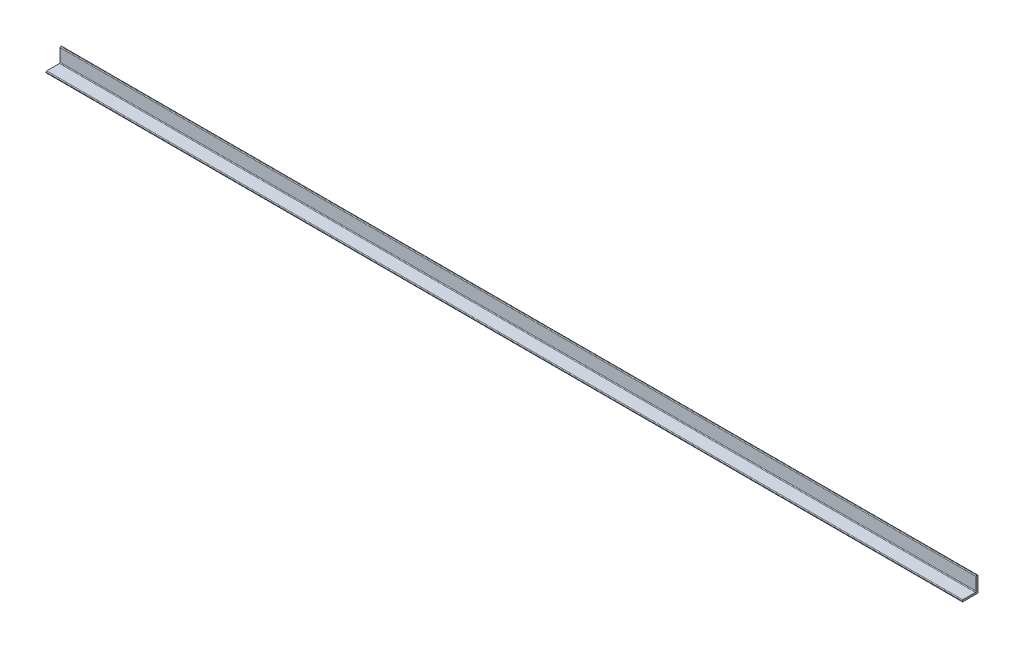
ISO-10303-21;
HEADER;
FILE_DESCRIPTION(('STEP AP214'),'2;1');
FILE_NAME('part.step','',(''),(''),'','','');
FILE_SCHEMA(('AUTOMOTIVE_DESIGN { 1 0 10303 214 1 1 1 1 }'));
ENDSEC;
DATA;
#1=APPLICATION_CONTEXT('core data for automotive mechanical design processes');
#2=APPLICATION_PROTOCOL_DEFINITION('international standard','automotive_design',2000,#1);
#3=PRODUCT_CONTEXT('',#1,'mechanical');
#4=PRODUCT('Part','Part','',(#3));
#5=PRODUCT_RELATED_PRODUCT_CATEGORY('part','',(#4));
#6=PRODUCT_DEFINITION_FORMATION('','',#4);
#7=PRODUCT_DEFINITION_CONTEXT('part definition',#1,'design');
#8=PRODUCT_DEFINITION('design','',#6,#7);
#9=PRODUCT_DEFINITION_SHAPE('','',#8);
#10=(LENGTH_UNIT() NAMED_UNIT(*) SI_UNIT(.MILLI.,.METRE.));
#11=(NAMED_UNIT(*) PLANE_ANGLE_UNIT() SI_UNIT($,.RADIAN.));
#12=(NAMED_UNIT(*) SI_UNIT($,.STERADIAN.) SOLID_ANGLE_UNIT());
#13=UNCERTAINTY_MEASURE_WITH_UNIT(LENGTH_MEASURE(1.E-05),#10,'distance_accuracy_value','');
#14=(GEOMETRIC_REPRESENTATION_CONTEXT(3) GLOBAL_UNCERTAINTY_ASSIGNED_CONTEXT((#13)) GLOBAL_UNIT_ASSIGNED_CONTEXT((#10,
#11,#12)) REPRESENTATION_CONTEXT('',''));
#15=CARTESIAN_POINT('',(0.,0.,0.));
#16=DIRECTION('',(0.,0.,1.));
#17=DIRECTION('',(1.,0.,0.));
#18=AXIS2_PLACEMENT_3D('',#15,#16,#17);
#19=CARTESIAN_POINT('',(650.,2.5,-11.25));
#20=DIRECTION('',(-1.,0.,0.));
#21=DIRECTION('',(0.,0.,1.));
#22=AXIS2_PLACEMENT_3D('',#19,#20,#21);
#23=PLANE('',#22);
#24=DIRECTION('',(0.,0.,-1.));
#25=VECTOR('',#24,1.);
#26=CARTESIAN_POINT('',(650.,0.,-11.25));
#27=LINE('',#26,#25);
#28=CARTESIAN_POINT('',(650.,0.,10.25));
#29=VERTEX_POINT('',#28);
#30=CARTESIAN_POINT('',(650.,0.,-10.25));
#31=VERTEX_POINT('',#30);
#32=EDGE_CURVE('E213',#29,#31,#27,.T.);
#33=ORIENTED_EDGE('',*,*,#32,.T.);
#34=CARTESIAN_POINT('',(650.,1.,-10.25));
#35=DIRECTION('',(-1.,0.,0.));
#36=DIRECTION('',(0.,0.,1.));
#37=AXIS2_PLACEMENT_3D('',#34,#35,#36);
#38=CIRCLE('',#37,1.);
#39=CARTESIAN_POINT('',(650.,1.,-11.25));
#40=VERTEX_POINT('',#39);
#41=EDGE_CURVE('E167',#31,#40,#38,.F.);
#42=ORIENTED_EDGE('',*,*,#41,.T.);
#43=DIRECTION('',(0.,-1.,0.));
#44=VECTOR('',#43,1.);
#45=CARTESIAN_POINT('',(650.,2.5,-11.25));
#46=LINE('',#45,#44);
#47=CARTESIAN_POINT('',(650.,21.5,-11.25));
#48=VERTEX_POINT('',#47);
#49=EDGE_CURVE('E142',#48,#40,#46,.T.);
#50=ORIENTED_EDGE('',*,*,#49,.F.);
#51=CARTESIAN_POINT('',(650.,21.5,-10.25));
#52=DIRECTION('',(-1.,0.,0.));
#53=DIRECTION('',(0.,0.,1.));
#54=AXIS2_PLACEMENT_3D('',#51,#52,#53);
#55=CIRCLE('',#54,1.);
#56=CARTESIAN_POINT('',(650.,22.5,-10.25));
#57=VERTEX_POINT('',#56);
#58=EDGE_CURVE('E146',#48,#57,#55,.F.);
#59=ORIENTED_EDGE('',*,*,#58,.T.);
#60=DIRECTION('',(0.,0.,-1.));
#61=VECTOR('',#60,1.);
#62=CARTESIAN_POINT('',(650.,22.5,-11.25));
#63=LINE('',#62,#61);
#64=CARTESIAN_POINT('',(650.,22.5,-9.74999999999999));
#65=VERTEX_POINT('',#64);
#66=EDGE_CURVE('E216',#65,#57,#63,.T.);
#67=ORIENTED_EDGE('',*,*,#66,.F.);
#68=CARTESIAN_POINT('',(650.,21.5,-9.74999999999999));
#69=DIRECTION('',(-1.,0.,0.));
#70=DIRECTION('',(0.,0.,1.));
#71=AXIS2_PLACEMENT_3D('',#68,#69,#70);
#72=CIRCLE('',#71,1.);
#73=CARTESIAN_POINT('',(650.,21.5,-8.75));
#74=VERTEX_POINT('',#73);
#75=EDGE_CURVE('E163',#65,#74,#72,.F.);
#76=ORIENTED_EDGE('',*,*,#75,.T.);
#77=DIRECTION('',(0.,-1.,0.));
#78=VECTOR('',#77,1.);
#79=CARTESIAN_POINT('',(650.,22.5,-8.75));
#80=LINE('',#79,#78);
#81=CARTESIAN_POINT('',(650.,3.5,-8.75));
#82=VERTEX_POINT('',#81);
#83=EDGE_CURVE('E192',#74,#82,#80,.T.);
#84=ORIENTED_EDGE('',*,*,#83,.T.);
#85=CARTESIAN_POINT('',(650.,3.5,-7.75));
#86=DIRECTION('',(-1.,0.,0.));
#87=DIRECTION('',(0.,0.,1.));
#88=AXIS2_PLACEMENT_3D('',#85,#86,#87);
#89=CIRCLE('',#88,1.);
#90=CARTESIAN_POINT('',(650.,2.5,-7.75));
#91=VERTEX_POINT('',#90);
#92=EDGE_CURVE('E40',#82,#91,#89,.T.);
#93=ORIENTED_EDGE('',*,*,#92,.T.);
#94=DIRECTION('',(0.,0.,-1.));
#95=VECTOR('',#94,1.);
#96=CARTESIAN_POINT('',(650.,2.5,-11.25));
#97=LINE('',#96,#95);
#98=CARTESIAN_POINT('',(650.,2.5,10.25));
#99=VERTEX_POINT('',#98);
#100=EDGE_CURVE('E190',#99,#91,#97,.T.);
#101=ORIENTED_EDGE('',*,*,#100,.F.);
#102=CARTESIAN_POINT('',(650.,1.5,10.25));
#103=DIRECTION('',(-1.,0.,0.));
#104=DIRECTION('',(0.,0.,1.));
#105=AXIS2_PLACEMENT_3D('',#102,#103,#104);
#106=CIRCLE('',#105,1.);
#107=CARTESIAN_POINT('',(650.,1.5,11.25));
#108=VERTEX_POINT('',#107);
#109=EDGE_CURVE('E55',#99,#108,#106,.F.);
#110=ORIENTED_EDGE('',*,*,#109,.T.);
#111=DIRECTION('',(0.,-1.,0.));
#112=VECTOR('',#111,1.);
#113=CARTESIAN_POINT('',(650.,2.5,11.25));
#114=LINE('',#113,#112);
#115=CARTESIAN_POINT('',(650.,1.,11.25));
#116=VERTEX_POINT('',#115);
#117=EDGE_CURVE('E220',#108,#116,#114,.T.);
#118=ORIENTED_EDGE('',*,*,#117,.T.);
#119=CARTESIAN_POINT('',(650.,1.,10.25));
#120=DIRECTION('',(-1.,0.,0.));
#121=DIRECTION('',(0.,0.,1.));
#122=AXIS2_PLACEMENT_3D('',#119,#120,#121);
#123=CIRCLE('',#122,1.);
#124=EDGE_CURVE('E47',#116,#29,#123,.F.);
#125=ORIENTED_EDGE('',*,*,#124,.T.);
#126=EDGE_LOOP('',(#33,#42,#50,#59,#67,#76,#84,#93,#101,#110,#118,#125));
#127=FACE_BOUND('',#126,.T.);
#128=ADVANCED_FACE('F32',(#127),#23,.F.);
#129=CARTESIAN_POINT('',(-650.,2.5,-11.25));
#130=DIRECTION('',(0.,0.,1.));
#131=DIRECTION('',(1.,0.,0.));
#132=AXIS2_PLACEMENT_3D('',#129,#130,#131);
#133=PLANE('',#132);
#134=ORIENTED_EDGE('',*,*,#49,.T.);
#135=DIRECTION('',(-1.,0.,0.));
#136=VECTOR('',#135,1.);
#137=CARTESIAN_POINT('',(-650.,1.,-11.25));
#138=LINE('',#137,#136);
#139=CARTESIAN_POINT('',(-650.,1.,-11.25));
#140=VERTEX_POINT('',#139);
#141=EDGE_CURVE('E133',#40,#140,#138,.T.);
#142=ORIENTED_EDGE('',*,*,#141,.T.);
#143=DIRECTION('',(0.,-1.,0.));
#144=VECTOR('',#143,1.);
#145=CARTESIAN_POINT('',(-650.,2.5,-11.25));
#146=LINE('',#145,#144);
#147=CARTESIAN_POINT('',(-650.,21.5,-11.25));
#148=VERTEX_POINT('',#147);
#149=EDGE_CURVE('E125',#148,#140,#146,.T.);
#150=ORIENTED_EDGE('',*,*,#149,.F.);
#151=DIRECTION('',(-1.,0.,0.));
#152=VECTOR('',#151,1.);
#153=CARTESIAN_POINT('',(650.,21.5,-11.25));
#154=LINE('',#153,#152);
#155=EDGE_CURVE('E139',#148,#48,#154,.F.);
#156=ORIENTED_EDGE('',*,*,#155,.T.);
#157=EDGE_LOOP('',(#134,#142,#150,#156));
#158=FACE_BOUND('',#157,.T.);
#159=ADVANCED_FACE('F138',(#158),#133,.F.);
#160=CARTESIAN_POINT('',(-650.,2.5,-11.25));
#161=DIRECTION('',(1.,0.,0.));
#162=DIRECTION('',(0.,0.,-1.));
#163=AXIS2_PLACEMENT_3D('',#160,#161,#162);
#164=PLANE('',#163);
#165=ORIENTED_EDGE('',*,*,#149,.T.);
#166=CARTESIAN_POINT('',(-650.,1.,-10.25));
#167=DIRECTION('',(1.,0.,0.));
#168=DIRECTION('',(0.,0.,-1.));
#169=AXIS2_PLACEMENT_3D('',#166,#167,#168);
#170=CIRCLE('',#169,1.);
#171=CARTESIAN_POINT('',(-650.,0.,-10.25));
#172=VERTEX_POINT('',#171);
#173=EDGE_CURVE('E156',#140,#172,#170,.F.);
#174=ORIENTED_EDGE('',*,*,#173,.T.);
#175=DIRECTION('',(0.,0.,1.));
#176=VECTOR('',#175,1.);
#177=CARTESIAN_POINT('',(-650.,0.,-11.25));
#178=LINE('',#177,#176);
#179=CARTESIAN_POINT('',(-650.,0.,10.25));
#180=VERTEX_POINT('',#179);
#181=EDGE_CURVE('E202',#172,#180,#178,.T.);
#182=ORIENTED_EDGE('',*,*,#181,.T.);
#183=CARTESIAN_POINT('',(-650.,1.,10.25));
#184=DIRECTION('',(1.,0.,0.));
#185=DIRECTION('',(0.,0.,-1.));
#186=AXIS2_PLACEMENT_3D('',#183,#184,#185);
#187=CIRCLE('',#186,1.);
#188=CARTESIAN_POINT('',(-650.,1.,11.25));
#189=VERTEX_POINT('',#188);
#190=EDGE_CURVE('E154',#180,#189,#187,.F.);
#191=ORIENTED_EDGE('',*,*,#190,.T.);
#192=DIRECTION('',(0.,-1.,0.));
#193=VECTOR('',#192,1.);
#194=CARTESIAN_POINT('',(-650.,2.5,11.25));
#195=LINE('',#194,#193);
#196=CARTESIAN_POINT('',(-650.,1.5,11.25));
#197=VERTEX_POINT('',#196);
#198=EDGE_CURVE('E143',#197,#189,#195,.T.);
#199=ORIENTED_EDGE('',*,*,#198,.F.);
#200=CARTESIAN_POINT('',(-650.,1.5,10.25));
#201=DIRECTION('',(1.,0.,0.));
#202=DIRECTION('',(0.,0.,-1.));
#203=AXIS2_PLACEMENT_3D('',#200,#201,#202);
#204=CIRCLE('',#203,1.);
#205=CARTESIAN_POINT('',(-650.,2.5,10.25));
#206=VERTEX_POINT('',#205);
#207=EDGE_CURVE('E152',#197,#206,#204,.F.);
#208=ORIENTED_EDGE('',*,*,#207,.T.);
#209=DIRECTION('',(0.,0.,1.));
#210=VECTOR('',#209,1.);
#211=CARTESIAN_POINT('',(-650.,2.5,-11.25));
#212=LINE('',#211,#210);
#213=CARTESIAN_POINT('',(-650.,2.5,-7.75));
#214=VERTEX_POINT('',#213);
#215=EDGE_CURVE('E201',#214,#206,#212,.T.);
#216=ORIENTED_EDGE('',*,*,#215,.F.);
#217=CARTESIAN_POINT('',(-650.,3.5,-7.75));
#218=DIRECTION('',(1.,0.,0.));
#219=DIRECTION('',(0.,0.,-1.));
#220=AXIS2_PLACEMENT_3D('',#217,#218,#219);
#221=CIRCLE('',#220,1.);
#222=CARTESIAN_POINT('',(-650.,3.5,-8.75));
#223=VERTEX_POINT('',#222);
#224=EDGE_CURVE('E11',#214,#223,#221,.T.);
#225=ORIENTED_EDGE('',*,*,#224,.T.);
#226=DIRECTION('',(0.,-1.,0.));
#227=VECTOR('',#226,1.);
#228=CARTESIAN_POINT('',(-650.,22.5,-8.75));
#229=LINE('',#228,#227);
#230=CARTESIAN_POINT('',(-650.,21.5,-8.75));
#231=VERTEX_POINT('',#230);
#232=EDGE_CURVE('E208',#231,#223,#229,.T.);
#233=ORIENTED_EDGE('',*,*,#232,.F.);
#234=CARTESIAN_POINT('',(-650.,21.5,-9.74999999999999));
#235=DIRECTION('',(1.,0.,0.));
#236=DIRECTION('',(0.,0.,-1.));
#237=AXIS2_PLACEMENT_3D('',#234,#235,#236);
#238=CIRCLE('',#237,1.);
#239=CARTESIAN_POINT('',(-650.,22.5,-9.74999999999999));
#240=VERTEX_POINT('',#239);
#241=EDGE_CURVE('E132',#231,#240,#238,.F.);
#242=ORIENTED_EDGE('',*,*,#241,.T.);
#243=DIRECTION('',(0.,0.,1.));
#244=VECTOR('',#243,1.);
#245=CARTESIAN_POINT('',(-650.,22.5,-11.25));
#246=LINE('',#245,#244);
#247=CARTESIAN_POINT('',(-650.,22.5,-10.25));
#248=VERTEX_POINT('',#247);
#249=EDGE_CURVE('E127',#248,#240,#246,.T.);
#250=ORIENTED_EDGE('',*,*,#249,.F.);
#251=CARTESIAN_POINT('',(-650.,21.5,-10.25));
#252=DIRECTION('',(1.,0.,0.));
#253=DIRECTION('',(0.,0.,-1.));
#254=AXIS2_PLACEMENT_3D('',#251,#252,#253);
#255=CIRCLE('',#254,1.);
#256=EDGE_CURVE('E122',#248,#148,#255,.F.);
#257=ORIENTED_EDGE('',*,*,#256,.T.);
#258=EDGE_LOOP('',(#165,#174,#182,#191,#199,#208,#216,#225,#233,#242,#250,#257));
#259=FACE_BOUND('',#258,.T.);
#260=ADVANCED_FACE('F124',(#259),#164,.F.);
#261=CARTESIAN_POINT('',(-650.,2.5,11.25));
#262=DIRECTION('',(0.,0.,-1.));
#263=DIRECTION('',(-1.,0.,0.));
#264=AXIS2_PLACEMENT_3D('',#261,#262,#263);
#265=PLANE('',#264);
#266=ORIENTED_EDGE('',*,*,#198,.T.);
#267=DIRECTION('',(1.,0.,0.));
#268=VECTOR('',#267,1.);
#269=CARTESIAN_POINT('',(-650.,1.,11.25));
#270=LINE('',#269,#268);
#271=EDGE_CURVE('E171',#189,#116,#270,.T.);
#272=ORIENTED_EDGE('',*,*,#271,.T.);
#273=ORIENTED_EDGE('',*,*,#117,.F.);
#274=DIRECTION('',(1.,0.,0.));
#275=VECTOR('',#274,1.);
#276=CARTESIAN_POINT('',(-650.,1.5,11.25));
#277=LINE('',#276,#275);
#278=EDGE_CURVE('E169',#108,#197,#277,.F.);
#279=ORIENTED_EDGE('',*,*,#278,.T.);
#280=EDGE_LOOP('',(#266,#272,#273,#279));
#281=FACE_BOUND('',#280,.T.);
#282=ADVANCED_FACE('F228',(#281),#265,.F.);
#283=CARTESIAN_POINT('',(0.,2.5,0.));
#284=DIRECTION('',(0.,1.,0.));
#285=DIRECTION('',(0.,0.,1.));
#286=AXIS2_PLACEMENT_3D('',#283,#284,#285);
#287=PLANE('',#286);
#288=ORIENTED_EDGE('',*,*,#215,.T.);
#289=DIRECTION('',(1.,0.,0.));
#290=VECTOR('',#289,1.);
#291=CARTESIAN_POINT('',(650.,2.5,10.25));
#292=LINE('',#291,#290);
#293=EDGE_CURVE('E175',#206,#99,#292,.T.);
#294=ORIENTED_EDGE('',*,*,#293,.T.);
#295=ORIENTED_EDGE('',*,*,#100,.T.);
#296=DIRECTION('',(1.,0.,0.));
#297=VECTOR('',#296,1.);
#298=CARTESIAN_POINT('',(0.,2.5,-7.75));
#299=LINE('',#298,#297);
#300=EDGE_CURVE('E173',#91,#214,#299,.F.);
#301=ORIENTED_EDGE('',*,*,#300,.T.);
#302=EDGE_LOOP('',(#288,#294,#295,#301));
#303=FACE_BOUND('',#302,.T.);
#304=ADVANCED_FACE('F198',(#303),#287,.T.);
#305=CARTESIAN_POINT('',(0.,0.,0.));
#306=DIRECTION('',(0.,1.,0.));
#307=DIRECTION('',(0.,0.,1.));
#308=AXIS2_PLACEMENT_3D('',#305,#306,#307);
#309=PLANE('',#308);
#310=ORIENTED_EDGE('',*,*,#181,.F.);
#311=DIRECTION('',(-1.,0.,0.));
#312=VECTOR('',#311,1.);
#313=CARTESIAN_POINT('',(0.,0.,-10.25));
#314=LINE('',#313,#312);
#315=EDGE_CURVE('E160',#172,#31,#314,.F.);
#316=ORIENTED_EDGE('',*,*,#315,.T.);
#317=ORIENTED_EDGE('',*,*,#32,.F.);
#318=DIRECTION('',(1.,0.,0.));
#319=VECTOR('',#318,1.);
#320=CARTESIAN_POINT('',(0.,0.,10.25));
#321=LINE('',#320,#319);
#322=EDGE_CURVE('E158',#29,#180,#321,.F.);
#323=ORIENTED_EDGE('',*,*,#322,.T.);
#324=EDGE_LOOP('',(#310,#316,#317,#323));
#325=FACE_BOUND('',#324,.T.);
#326=ADVANCED_FACE('F236',(#325),#309,.F.);
#327=CARTESIAN_POINT('',(-650.,22.5,-8.75));
#328=DIRECTION('',(0.,0.,-1.));
#329=DIRECTION('',(-1.,0.,0.));
#330=AXIS2_PLACEMENT_3D('',#327,#328,#329);
#331=PLANE('',#330);
#332=ORIENTED_EDGE('',*,*,#232,.T.);
#333=DIRECTION('',(1.,0.,0.));
#334=VECTOR('',#333,1.);
#335=CARTESIAN_POINT('',(-650.,3.5,-8.75));
#336=LINE('',#335,#334);
#337=EDGE_CURVE('E180',#223,#82,#336,.T.);
#338=ORIENTED_EDGE('',*,*,#337,.T.);
#339=ORIENTED_EDGE('',*,*,#83,.F.);
#340=DIRECTION('',(1.,0.,0.));
#341=VECTOR('',#340,1.);
#342=CARTESIAN_POINT('',(-650.,21.5,-8.75));
#343=LINE('',#342,#341);
#344=EDGE_CURVE('E178',#74,#231,#343,.F.);
#345=ORIENTED_EDGE('',*,*,#344,.T.);
#346=EDGE_LOOP('',(#332,#338,#339,#345));
#347=FACE_BOUND('',#346,.T.);
#348=ADVANCED_FACE('F211',(#347),#331,.F.);
#349=CARTESIAN_POINT('',(0.,22.5,0.));
#350=DIRECTION('',(0.,1.,0.));
#351=DIRECTION('',(0.,0.,1.));
#352=AXIS2_PLACEMENT_3D('',#349,#350,#351);
#353=PLANE('',#352);
#354=ORIENTED_EDGE('',*,*,#249,.T.);
#355=DIRECTION('',(1.,0.,0.));
#356=VECTOR('',#355,1.);
#357=CARTESIAN_POINT('',(650.,22.5,-9.74999999999999));
#358=LINE('',#357,#356);
#359=EDGE_CURVE('E185',#240,#65,#358,.T.);
#360=ORIENTED_EDGE('',*,*,#359,.T.);
#361=ORIENTED_EDGE('',*,*,#66,.T.);
#362=DIRECTION('',(-1.,0.,0.));
#363=VECTOR('',#362,1.);
#364=CARTESIAN_POINT('',(-650.,22.5,-10.25));
#365=LINE('',#364,#363);
#366=EDGE_CURVE('E183',#57,#248,#365,.T.);
#367=ORIENTED_EDGE('',*,*,#366,.T.);
#368=EDGE_LOOP('',(#354,#360,#361,#367));
#369=FACE_BOUND('',#368,.T.);
#370=ADVANCED_FACE('F261',(#369),#353,.T.);
#371=CARTESIAN_POINT('',(-650.,1.,-10.25));
#372=DIRECTION('',(-1.,0.,0.));
#373=DIRECTION('',(0.,0.,1.));
#374=AXIS2_PLACEMENT_3D('',#371,#372,#373);
#375=CYLINDRICAL_SURFACE('',#374,1.);
#376=ORIENTED_EDGE('',*,*,#41,.F.);
#377=ORIENTED_EDGE('',*,*,#315,.F.);
#378=ORIENTED_EDGE('',*,*,#173,.F.);
#379=ORIENTED_EDGE('',*,*,#141,.F.);
#380=EDGE_LOOP('',(#376,#377,#378,#379));
#381=FACE_BOUND('',#380,.T.);
#382=ADVANCED_FACE('F240',(#381),#375,.T.);
#383=CARTESIAN_POINT('',(-650.,1.,10.25));
#384=DIRECTION('',(1.,0.,0.));
#385=DIRECTION('',(0.,0.,-1.));
#386=AXIS2_PLACEMENT_3D('',#383,#384,#385);
#387=CYLINDRICAL_SURFACE('',#386,1.);
#388=ORIENTED_EDGE('',*,*,#190,.F.);
#389=ORIENTED_EDGE('',*,*,#322,.F.);
#390=ORIENTED_EDGE('',*,*,#124,.F.);
#391=ORIENTED_EDGE('',*,*,#271,.F.);
#392=EDGE_LOOP('',(#388,#389,#390,#391));
#393=FACE_BOUND('',#392,.T.);
#394=ADVANCED_FACE('F232',(#393),#387,.T.);
#395=CARTESIAN_POINT('',(0.,1.5,10.25));
#396=DIRECTION('',(-1.,0.,0.));
#397=DIRECTION('',(0.,0.,1.));
#398=AXIS2_PLACEMENT_3D('',#395,#396,#397);
#399=CYLINDRICAL_SURFACE('',#398,1.);
#400=ORIENTED_EDGE('',*,*,#207,.F.);
#401=ORIENTED_EDGE('',*,*,#278,.F.);
#402=ORIENTED_EDGE('',*,*,#109,.F.);
#403=ORIENTED_EDGE('',*,*,#293,.F.);
#404=EDGE_LOOP('',(#400,#401,#402,#403));
#405=FACE_BOUND('',#404,.T.);
#406=ADVANCED_FACE('F242',(#405),#399,.T.);
#407=CARTESIAN_POINT('',(-650.,3.5,-7.75));
#408=DIRECTION('',(1.,0.,0.));
#409=DIRECTION('',(0.,0.,-1.));
#410=AXIS2_PLACEMENT_3D('',#407,#408,#409);
#411=CYLINDRICAL_SURFACE('',#410,1.);
#412=ORIENTED_EDGE('',*,*,#224,.F.);
#413=ORIENTED_EDGE('',*,*,#300,.F.);
#414=ORIENTED_EDGE('',*,*,#92,.F.);
#415=ORIENTED_EDGE('',*,*,#337,.F.);
#416=EDGE_LOOP('',(#412,#413,#414,#415));
#417=FACE_BOUND('',#416,.T.);
#418=ADVANCED_FACE('F205',(#417),#411,.F.);
#419=CARTESIAN_POINT('',(0.,21.5,-9.74999999999999));
#420=DIRECTION('',(-1.,0.,0.));
#421=DIRECTION('',(0.,0.,1.));
#422=AXIS2_PLACEMENT_3D('',#419,#420,#421);
#423=CYLINDRICAL_SURFACE('',#422,1.);
#424=ORIENTED_EDGE('',*,*,#241,.F.);
#425=ORIENTED_EDGE('',*,*,#344,.F.);
#426=ORIENTED_EDGE('',*,*,#75,.F.);
#427=ORIENTED_EDGE('',*,*,#359,.F.);
#428=EDGE_LOOP('',(#424,#425,#426,#427));
#429=FACE_BOUND('',#428,.T.);
#430=ADVANCED_FACE('F249',(#429),#423,.T.);
#431=CARTESIAN_POINT('',(0.,21.5,-10.25));
#432=DIRECTION('',(1.,0.,0.));
#433=DIRECTION('',(0.,0.,-1.));
#434=AXIS2_PLACEMENT_3D('',#431,#432,#433);
#435=CYLINDRICAL_SURFACE('',#434,1.);
#436=ORIENTED_EDGE('',*,*,#58,.F.);
#437=ORIENTED_EDGE('',*,*,#155,.F.);
#438=ORIENTED_EDGE('',*,*,#256,.F.);
#439=ORIENTED_EDGE('',*,*,#366,.F.);
#440=EDGE_LOOP('',(#436,#437,#438,#439));
#441=FACE_BOUND('',#440,.T.);
#442=ADVANCED_FACE('F34',(#441),#435,.T.);
#443=CLOSED_SHELL('',(#128,#159,#260,#282,#304,#326,#348,#370,#382,#394,#406,#418,#430,#442));
#444=MANIFOLD_SOLID_BREP('B2',#443);
#445=ADVANCED_BREP_SHAPE_REPRESENTATION('',(#18,#444),#14);
#446=SHAPE_DEFINITION_REPRESENTATION(#9,#445);
ENDSEC;
END-ISO-10303-21;
